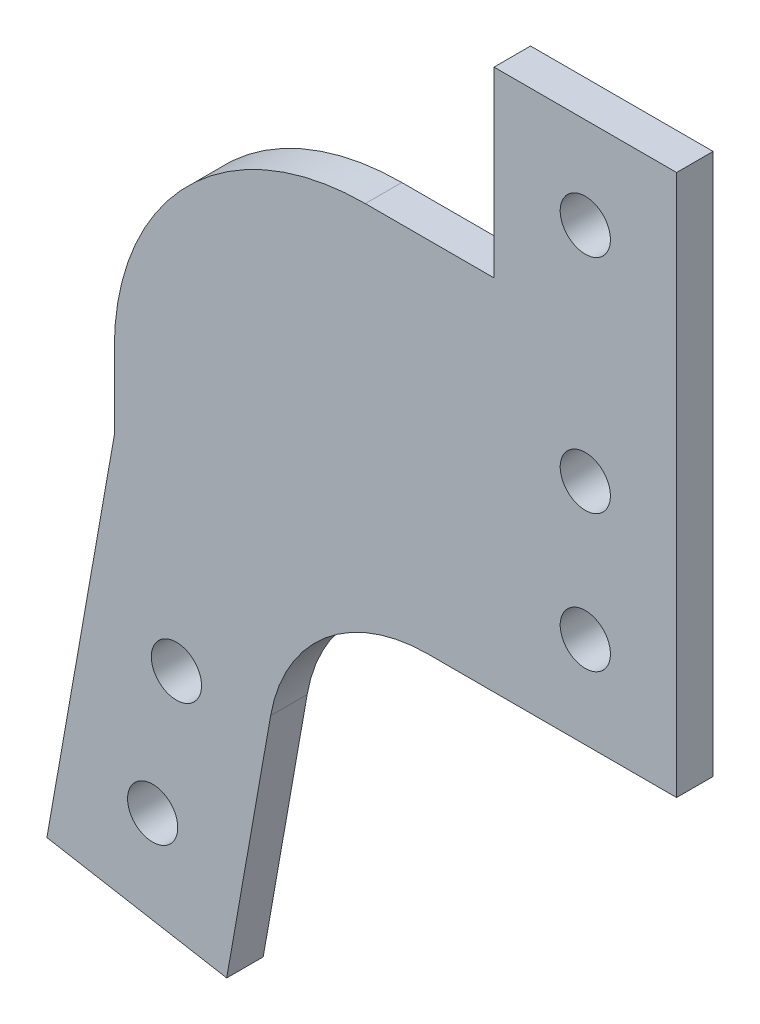
ISO-10303-21;
HEADER;
FILE_DESCRIPTION(('STEP AP214'),'2;1');
FILE_NAME('part.step','',(''),(''),'','','');
FILE_SCHEMA(('AUTOMOTIVE_DESIGN { 1 0 10303 214 1 1 1 1 }'));
ENDSEC;
DATA;
#1=APPLICATION_CONTEXT('core data for automotive mechanical design processes');
#2=APPLICATION_PROTOCOL_DEFINITION('international standard','automotive_design',2000,#1);
#3=PRODUCT_CONTEXT('',#1,'mechanical');
#4=PRODUCT('Part','Part','',(#3));
#5=PRODUCT_RELATED_PRODUCT_CATEGORY('part','',(#4));
#6=PRODUCT_DEFINITION_FORMATION('','',#4);
#7=PRODUCT_DEFINITION_CONTEXT('part definition',#1,'design');
#8=PRODUCT_DEFINITION('design','',#6,#7);
#9=PRODUCT_DEFINITION_SHAPE('','',#8);
#10=(LENGTH_UNIT() NAMED_UNIT(*) SI_UNIT(.MILLI.,.METRE.));
#11=(NAMED_UNIT(*) PLANE_ANGLE_UNIT() SI_UNIT($,.RADIAN.));
#12=(NAMED_UNIT(*) SI_UNIT($,.STERADIAN.) SOLID_ANGLE_UNIT());
#13=UNCERTAINTY_MEASURE_WITH_UNIT(LENGTH_MEASURE(1.E-05),#10,'distance_accuracy_value','');
#14=(GEOMETRIC_REPRESENTATION_CONTEXT(3) GLOBAL_UNCERTAINTY_ASSIGNED_CONTEXT((#13)) GLOBAL_UNIT_ASSIGNED_CONTEXT((#10,
#11,#12)) REPRESENTATION_CONTEXT('',''));
#15=CARTESIAN_POINT('',(0.,0.,0.));
#16=DIRECTION('',(0.,0.,1.));
#17=DIRECTION('',(1.,0.,0.));
#18=AXIS2_PLACEMENT_3D('',#15,#16,#17);
#19=CARTESIAN_POINT('',(7.82058165548103,11.8,4.));
#20=DIRECTION('',(0.,0.,1.));
#21=DIRECTION('',(1.,0.,0.));
#22=AXIS2_PLACEMENT_3D('',#19,#20,#21);
#23=PLANE('',#22);
#24=CARTESIAN_POINT('',(-15.474906588572,-30.174851564615,4.));
#25=DIRECTION('',(0.,0.,1.));
#26=DIRECTION('',(1.,0.,0.));
#27=AXIS2_PLACEMENT_3D('',#24,#25,#26);
#28=CIRCLE('',#27,2.75);
#29=CARTESIAN_POINT('',(-12.724906588572,-30.174851564615,4.));
#30=VERTEX_POINT('',#29);
#31=EDGE_CURVE('E281',#30,#30,#28,.T.);
#32=ORIENTED_EDGE('',*,*,#31,.F.);
#33=EDGE_LOOP('',(#32));
#34=FACE_BOUND('',#33,.T.);
#35=CARTESIAN_POINT('',(31.920581655481,25.,4.));
#36=DIRECTION('',(0.,0.,1.));
#37=DIRECTION('',(1.,0.,0.));
#38=AXIS2_PLACEMENT_3D('',#35,#36,#37);
#39=CIRCLE('',#38,2.75);
#40=CARTESIAN_POINT('',(34.670581655481,25.,4.));
#41=VERTEX_POINT('',#40);
#42=EDGE_CURVE('E293',#41,#41,#39,.T.);
#43=ORIENTED_EDGE('',*,*,#42,.F.);
#44=EDGE_LOOP('',(#43));
#45=FACE_BOUND('',#44,.T.);
#46=DIRECTION('',(0.,1.,0.));
#47=VECTOR('',#46,1.);
#48=CARTESIAN_POINT('',(41.920581655481,0.,4.));
#49=LINE('',#48,#47);
#50=CARTESIAN_POINT('',(41.920581655481,0.,4.));
#51=VERTEX_POINT('',#50);
#52=CARTESIAN_POINT('',(41.920581655481,59.3,4.));
#53=VERTEX_POINT('',#52);
#54=EDGE_CURVE('E169',#51,#53,#49,.T.);
#55=ORIENTED_EDGE('',*,*,#54,.T.);
#56=DIRECTION('',(-1.,0.,0.));
#57=VECTOR('',#56,1.);
#58=CARTESIAN_POINT('',(41.920581655481,59.3,4.));
#59=LINE('',#58,#57);
#60=CARTESIAN_POINT('',(21.920581655481,59.3,4.));
#61=VERTEX_POINT('',#60);
#62=EDGE_CURVE('E102',#53,#61,#59,.T.);
#63=ORIENTED_EDGE('',*,*,#62,.T.);
#64=DIRECTION('',(0.,-1.,0.));
#65=VECTOR('',#64,1.);
#66=CARTESIAN_POINT('',(21.920581655481,59.3,4.));
#67=LINE('',#66,#65);
#68=CARTESIAN_POINT('',(21.920581655481,39.3,4.));
#69=VERTEX_POINT('',#68);
#70=EDGE_CURVE('E193',#61,#69,#67,.T.);
#71=ORIENTED_EDGE('',*,*,#70,.T.);
#72=DIRECTION('',(-1.,0.,0.));
#73=VECTOR('',#72,1.);
#74=CARTESIAN_POINT('',(21.920581655481,39.3,4.));
#75=LINE('',#74,#73);
#76=CARTESIAN_POINT('',(7.82058165548122,39.3,4.));
#77=VERTEX_POINT('',#76);
#78=EDGE_CURVE('E212',#69,#77,#75,.T.);
#79=ORIENTED_EDGE('',*,*,#78,.T.);
#80=CARTESIAN_POINT('',(7.82058165548103,11.8,4.));
#81=DIRECTION('',(0.,0.,1.));
#82=DIRECTION('',(1.,0.,0.));
#83=AXIS2_PLACEMENT_3D('',#80,#81,#82);
#84=CIRCLE('',#83,27.5);
#85=CARTESIAN_POINT('',(-19.679418344519,11.7999999999998,4.));
#86=VERTEX_POINT('',#85);
#87=EDGE_CURVE('E209',#77,#86,#84,.T.);
#88=ORIENTED_EDGE('',*,*,#87,.T.);
#89=DIRECTION('',(0.,-1.,0.));
#90=VECTOR('',#89,1.);
#91=CARTESIAN_POINT('',(-19.679418344519,3.56788218495101,4.));
#92=LINE('',#91,#90);
#93=CARTESIAN_POINT('',(-19.679418344519,3.56788218495101,4.));
#94=VERTEX_POINT('',#93);
#95=EDGE_CURVE('E211',#86,#94,#92,.T.);
#96=ORIENTED_EDGE('',*,*,#95,.T.);
#97=DIRECTION('',(-0.173648177666927,-0.984807753012209,0.));
#98=VECTOR('',#97,1.);
#99=CARTESIAN_POINT('',(-27.0594658953634,-38.2864473180679,4.));
#100=LINE('',#99,#98);
#101=CARTESIAN_POINT('',(-27.0594658953634,-38.2864473180679,4.));
#102=VERTEX_POINT('',#101);
#103=EDGE_CURVE('E214',#94,#102,#100,.T.);
#104=ORIENTED_EDGE('',*,*,#103,.T.);
#105=DIRECTION('',(0.984807753012209,-0.173648177666928,0.));
#106=VECTOR('',#105,1.);
#107=CARTESIAN_POINT('',(-27.0594658953634,-38.2864473180679,4.));
#108=LINE('',#107,#106);
#109=CARTESIAN_POINT('',(-7.36331083511921,-41.7594108714064,4.));
#110=VERTEX_POINT('',#109);
#111=EDGE_CURVE('E130',#102,#110,#108,.T.);
#112=ORIENTED_EDGE('',*,*,#111,.T.);
#113=DIRECTION('',(0.173648177666927,0.984807753012208,0.));
#114=VECTOR('',#113,1.);
#115=CARTESIAN_POINT('',(-7.36331083511921,-41.7594108714064,4.));
#116=LINE('',#115,#114);
#117=CARTESIAN_POINT('',(-2.54989213211122,-14.4611568908289,4.));
#118=VERTEX_POINT('',#117);
#119=EDGE_CURVE('E124',#110,#118,#116,.T.);
#120=ORIENTED_EDGE('',*,*,#119,.T.);
#121=CARTESIAN_POINT('',(14.6842435456024,-17.5,4.));
#122=DIRECTION('',(0.,0.,-1.));
#123=DIRECTION('',(-1.,0.,0.));
#124=AXIS2_PLACEMENT_3D('',#121,#122,#123);
#125=CIRCLE('',#124,17.5);
#126=CARTESIAN_POINT('',(14.6842435456026,0.,4.));
#127=VERTEX_POINT('',#126);
#128=EDGE_CURVE('E128',#118,#127,#125,.T.);
#129=ORIENTED_EDGE('',*,*,#128,.T.);
#130=DIRECTION('',(1.,0.,0.));
#131=VECTOR('',#130,1.);
#132=CARTESIAN_POINT('',(14.6842435456026,0.,4.));
#133=LINE('',#132,#131);
#134=EDGE_CURVE('E50',#127,#51,#133,.T.);
#135=ORIENTED_EDGE('',*,*,#134,.T.);
#136=EDGE_LOOP('',(#55,#63,#71,#79,#88,#96,#104,#112,#120,#129,#135));
#137=FACE_BOUND('',#136,.T.);
#138=CARTESIAN_POINT('',(31.920581655481,49.3,4.));
#139=DIRECTION('',(0.,0.,1.));
#140=DIRECTION('',(1.,0.,0.));
#141=AXIS2_PLACEMENT_3D('',#138,#139,#140);
#142=CIRCLE('',#141,2.75);
#143=CARTESIAN_POINT('',(34.670581655481,49.3,4.));
#144=VERTEX_POINT('',#143);
#145=EDGE_CURVE('E152',#144,#144,#142,.T.);
#146=ORIENTED_EDGE('',*,*,#145,.F.);
#147=EDGE_LOOP('',(#146));
#148=FACE_BOUND('',#147,.T.);
#149=CARTESIAN_POINT('',(31.920581655481,10.,4.));
#150=DIRECTION('',(0.,0.,1.));
#151=DIRECTION('',(1.,0.,0.));
#152=AXIS2_PLACEMENT_3D('',#149,#150,#151);
#153=CIRCLE('',#152,2.75);
#154=CARTESIAN_POINT('',(34.670581655481,10.,4.));
#155=VERTEX_POINT('',#154);
#156=EDGE_CURVE('E287',#155,#155,#153,.T.);
#157=ORIENTED_EDGE('',*,*,#156,.F.);
#158=EDGE_LOOP('',(#157));
#159=FACE_BOUND('',#158,.T.);
#160=CARTESIAN_POINT('',(-12.8701839235681,-15.4027352694319,4.));
#161=DIRECTION('',(0.,0.,1.));
#162=DIRECTION('',(1.,0.,0.));
#163=AXIS2_PLACEMENT_3D('',#160,#161,#162);
#164=CIRCLE('',#163,2.75);
#165=CARTESIAN_POINT('',(-10.1201839235681,-15.4027352694319,4.));
#166=VERTEX_POINT('',#165);
#167=EDGE_CURVE('E272',#166,#166,#164,.T.);
#168=ORIENTED_EDGE('',*,*,#167,.F.);
#169=EDGE_LOOP('',(#168));
#170=FACE_BOUND('',#169,.T.);
#171=ADVANCED_FACE('F33',(#34,#45,#137,#148,#159,#170),#23,.T.);
#172=CARTESIAN_POINT('',(7.82058165548103,11.8,0.));
#173=DIRECTION('',(0.,0.,1.));
#174=DIRECTION('',(1.,0.,0.));
#175=AXIS2_PLACEMENT_3D('',#172,#173,#174);
#176=PLANE('',#175);
#177=DIRECTION('',(0.,1.,0.));
#178=VECTOR('',#177,1.);
#179=CARTESIAN_POINT('',(41.920581655481,0.,0.));
#180=LINE('',#179,#178);
#181=CARTESIAN_POINT('',(41.920581655481,0.,0.));
#182=VERTEX_POINT('',#181);
#183=CARTESIAN_POINT('',(41.920581655481,59.3,0.));
#184=VERTEX_POINT('',#183);
#185=EDGE_CURVE('E148',#182,#184,#180,.T.);
#186=ORIENTED_EDGE('',*,*,#185,.F.);
#187=DIRECTION('',(1.,0.,0.));
#188=VECTOR('',#187,1.);
#189=CARTESIAN_POINT('',(14.6842435456026,0.,0.));
#190=LINE('',#189,#188);
#191=CARTESIAN_POINT('',(14.6842435456026,0.,0.));
#192=VERTEX_POINT('',#191);
#193=EDGE_CURVE('E94',#192,#182,#190,.T.);
#194=ORIENTED_EDGE('',*,*,#193,.F.);
#195=CARTESIAN_POINT('',(14.6842435456024,-17.5,0.));
#196=DIRECTION('',(0.,0.,-1.));
#197=DIRECTION('',(-1.,0.,0.));
#198=AXIS2_PLACEMENT_3D('',#195,#196,#197);
#199=CIRCLE('',#198,17.5);
#200=CARTESIAN_POINT('',(-2.54989213211122,-14.4611568908289,0.));
#201=VERTEX_POINT('',#200);
#202=EDGE_CURVE('E88',#201,#192,#199,.T.);
#203=ORIENTED_EDGE('',*,*,#202,.F.);
#204=DIRECTION('',(0.173648177666927,0.984807753012208,0.));
#205=VECTOR('',#204,1.);
#206=CARTESIAN_POINT('',(-7.36331083511921,-41.7594108714064,0.));
#207=LINE('',#206,#205);
#208=CARTESIAN_POINT('',(-7.36331083511921,-41.7594108714064,0.));
#209=VERTEX_POINT('',#208);
#210=EDGE_CURVE('E138',#209,#201,#207,.T.);
#211=ORIENTED_EDGE('',*,*,#210,.F.);
#212=DIRECTION('',(0.984807753012209,-0.173648177666928,0.));
#213=VECTOR('',#212,1.);
#214=CARTESIAN_POINT('',(-27.0594658953634,-38.2864473180679,0.));
#215=LINE('',#214,#213);
#216=CARTESIAN_POINT('',(-27.0594658953634,-38.2864473180679,0.));
#217=VERTEX_POINT('',#216);
#218=EDGE_CURVE('E164',#217,#209,#215,.T.);
#219=ORIENTED_EDGE('',*,*,#218,.F.);
#220=DIRECTION('',(-0.173648177666927,-0.984807753012209,0.));
#221=VECTOR('',#220,1.);
#222=CARTESIAN_POINT('',(-27.0594658953634,-38.2864473180679,0.));
#223=LINE('',#222,#221);
#224=CARTESIAN_POINT('',(-19.679418344519,3.56788218495101,0.));
#225=VERTEX_POINT('',#224);
#226=EDGE_CURVE('E162',#225,#217,#223,.T.);
#227=ORIENTED_EDGE('',*,*,#226,.F.);
#228=DIRECTION('',(0.,-1.,0.));
#229=VECTOR('',#228,1.);
#230=CARTESIAN_POINT('',(-19.679418344519,3.56788218495101,0.));
#231=LINE('',#230,#229);
#232=CARTESIAN_POINT('',(-19.679418344519,11.7999999999998,0.));
#233=VERTEX_POINT('',#232);
#234=EDGE_CURVE('E160',#233,#225,#231,.T.);
#235=ORIENTED_EDGE('',*,*,#234,.F.);
#236=CARTESIAN_POINT('',(7.82058165548103,11.8,0.));
#237=DIRECTION('',(0.,0.,1.));
#238=DIRECTION('',(1.,0.,0.));
#239=AXIS2_PLACEMENT_3D('',#236,#237,#238);
#240=CIRCLE('',#239,27.5);
#241=CARTESIAN_POINT('',(7.82058165548122,39.3,0.));
#242=VERTEX_POINT('',#241);
#243=EDGE_CURVE('E158',#242,#233,#240,.T.);
#244=ORIENTED_EDGE('',*,*,#243,.F.);
#245=DIRECTION('',(-1.,0.,0.));
#246=VECTOR('',#245,1.);
#247=CARTESIAN_POINT('',(21.920581655481,39.3,0.));
#248=LINE('',#247,#246);
#249=CARTESIAN_POINT('',(21.920581655481,39.3,0.));
#250=VERTEX_POINT('',#249);
#251=EDGE_CURVE('E156',#250,#242,#248,.T.);
#252=ORIENTED_EDGE('',*,*,#251,.F.);
#253=DIRECTION('',(0.,-1.,0.));
#254=VECTOR('',#253,1.);
#255=CARTESIAN_POINT('',(21.920581655481,59.3,0.));
#256=LINE('',#255,#254);
#257=CARTESIAN_POINT('',(21.920581655481,59.3,0.));
#258=VERTEX_POINT('',#257);
#259=EDGE_CURVE('E154',#258,#250,#256,.T.);
#260=ORIENTED_EDGE('',*,*,#259,.F.);
#261=DIRECTION('',(-1.,0.,0.));
#262=VECTOR('',#261,1.);
#263=CARTESIAN_POINT('',(41.920581655481,59.3,0.));
#264=LINE('',#263,#262);
#265=EDGE_CURVE('E151',#184,#258,#264,.T.);
#266=ORIENTED_EDGE('',*,*,#265,.F.);
#267=EDGE_LOOP('',(#186,#194,#203,#211,#219,#227,#235,#244,#252,#260,#266));
#268=FACE_BOUND('',#267,.T.);
#269=CARTESIAN_POINT('',(31.920581655481,49.3,0.));
#270=DIRECTION('',(0.,0.,1.));
#271=DIRECTION('',(1.,0.,0.));
#272=AXIS2_PLACEMENT_3D('',#269,#270,#271);
#273=CIRCLE('',#272,2.75);
#274=CARTESIAN_POINT('',(34.670581655481,49.3,0.));
#275=VERTEX_POINT('',#274);
#276=EDGE_CURVE('E296',#275,#275,#273,.T.);
#277=ORIENTED_EDGE('',*,*,#276,.T.);
#278=EDGE_LOOP('',(#277));
#279=FACE_BOUND('',#278,.T.);
#280=CARTESIAN_POINT('',(31.920581655481,25.,0.));
#281=DIRECTION('',(0.,0.,1.));
#282=DIRECTION('',(1.,0.,0.));
#283=AXIS2_PLACEMENT_3D('',#280,#281,#282);
#284=CIRCLE('',#283,2.75);
#285=CARTESIAN_POINT('',(34.670581655481,25.,0.));
#286=VERTEX_POINT('',#285);
#287=EDGE_CURVE('E290',#286,#286,#284,.T.);
#288=ORIENTED_EDGE('',*,*,#287,.T.);
#289=EDGE_LOOP('',(#288));
#290=FACE_BOUND('',#289,.T.);
#291=CARTESIAN_POINT('',(31.920581655481,10.,0.));
#292=DIRECTION('',(0.,0.,1.));
#293=DIRECTION('',(1.,0.,0.));
#294=AXIS2_PLACEMENT_3D('',#291,#292,#293);
#295=CIRCLE('',#294,2.75);
#296=CARTESIAN_POINT('',(34.670581655481,10.,0.));
#297=VERTEX_POINT('',#296);
#298=EDGE_CURVE('E284',#297,#297,#295,.T.);
#299=ORIENTED_EDGE('',*,*,#298,.T.);
#300=EDGE_LOOP('',(#299));
#301=FACE_BOUND('',#300,.T.);
#302=CARTESIAN_POINT('',(-15.474906588572,-30.174851564615,0.));
#303=DIRECTION('',(0.,0.,1.));
#304=DIRECTION('',(1.,0.,0.));
#305=AXIS2_PLACEMENT_3D('',#302,#303,#304);
#306=CIRCLE('',#305,2.75);
#307=CARTESIAN_POINT('',(-12.724906588572,-30.174851564615,0.));
#308=VERTEX_POINT('',#307);
#309=EDGE_CURVE('E278',#308,#308,#306,.T.);
#310=ORIENTED_EDGE('',*,*,#309,.T.);
#311=EDGE_LOOP('',(#310));
#312=FACE_BOUND('',#311,.T.);
#313=CARTESIAN_POINT('',(-12.8701839235681,-15.4027352694319,0.));
#314=DIRECTION('',(0.,0.,1.));
#315=DIRECTION('',(1.,0.,0.));
#316=AXIS2_PLACEMENT_3D('',#313,#314,#315);
#317=CIRCLE('',#316,2.75);
#318=CARTESIAN_POINT('',(-10.1201839235681,-15.4027352694319,0.));
#319=VERTEX_POINT('',#318);
#320=EDGE_CURVE('E275',#319,#319,#317,.T.);
#321=ORIENTED_EDGE('',*,*,#320,.T.);
#322=EDGE_LOOP('',(#321));
#323=FACE_BOUND('',#322,.T.);
#324=ADVANCED_FACE('F197',(#268,#279,#290,#301,#312,#323),#176,.F.);
#325=CARTESIAN_POINT('',(41.920581655481,0.,4.));
#326=DIRECTION('',(-1.,0.,0.));
#327=DIRECTION('',(0.,0.,1.));
#328=AXIS2_PLACEMENT_3D('',#325,#326,#327);
#329=PLANE('',#328);
#330=ORIENTED_EDGE('',*,*,#185,.T.);
#331=DIRECTION('',(0.,0.,-1.));
#332=VECTOR('',#331,1.);
#333=CARTESIAN_POINT('',(41.920581655481,59.3,4.));
#334=LINE('',#333,#332);
#335=EDGE_CURVE('E11',#53,#184,#334,.T.);
#336=ORIENTED_EDGE('',*,*,#335,.F.);
#337=ORIENTED_EDGE('',*,*,#54,.F.);
#338=DIRECTION('',(0.,0.,-1.));
#339=VECTOR('',#338,1.);
#340=CARTESIAN_POINT('',(41.920581655481,0.,4.));
#341=LINE('',#340,#339);
#342=EDGE_CURVE('E144',#51,#182,#341,.T.);
#343=ORIENTED_EDGE('',*,*,#342,.T.);
#344=EDGE_LOOP('',(#330,#336,#337,#343));
#345=FACE_BOUND('',#344,.T.);
#346=ADVANCED_FACE('F35',(#345),#329,.F.);
#347=CARTESIAN_POINT('',(41.920581655481,59.3,4.));
#348=DIRECTION('',(0.,-1.,0.));
#349=DIRECTION('',(0.,0.,-1.));
#350=AXIS2_PLACEMENT_3D('',#347,#348,#349);
#351=PLANE('',#350);
#352=ORIENTED_EDGE('',*,*,#265,.T.);
#353=DIRECTION('',(0.,0.,-1.));
#354=VECTOR('',#353,1.);
#355=CARTESIAN_POINT('',(21.920581655481,59.3,4.));
#356=LINE('',#355,#354);
#357=EDGE_CURVE('E42',#61,#258,#356,.T.);
#358=ORIENTED_EDGE('',*,*,#357,.F.);
#359=ORIENTED_EDGE('',*,*,#62,.F.);
#360=ORIENTED_EDGE('',*,*,#335,.T.);
#361=EDGE_LOOP('',(#352,#358,#359,#360));
#362=FACE_BOUND('',#361,.T.);
#363=ADVANCED_FACE('F405',(#362),#351,.F.);
#364=CARTESIAN_POINT('',(21.920581655481,59.3,4.));
#365=DIRECTION('',(1.,0.,0.));
#366=DIRECTION('',(0.,0.,-1.));
#367=AXIS2_PLACEMENT_3D('',#364,#365,#366);
#368=PLANE('',#367);
#369=ORIENTED_EDGE('',*,*,#259,.T.);
#370=DIRECTION('',(0.,0.,-1.));
#371=VECTOR('',#370,1.);
#372=CARTESIAN_POINT('',(21.920581655481,39.3,4.));
#373=LINE('',#372,#371);
#374=EDGE_CURVE('E185',#69,#250,#373,.T.);
#375=ORIENTED_EDGE('',*,*,#374,.F.);
#376=ORIENTED_EDGE('',*,*,#70,.F.);
#377=ORIENTED_EDGE('',*,*,#357,.T.);
#378=EDGE_LOOP('',(#369,#375,#376,#377));
#379=FACE_BOUND('',#378,.T.);
#380=ADVANCED_FACE('F191',(#379),#368,.F.);
#381=CARTESIAN_POINT('',(21.920581655481,39.3,4.));
#382=DIRECTION('',(0.,-1.,0.));
#383=DIRECTION('',(0.,0.,-1.));
#384=AXIS2_PLACEMENT_3D('',#381,#382,#383);
#385=PLANE('',#384);
#386=ORIENTED_EDGE('',*,*,#251,.T.);
#387=DIRECTION('',(0.,0.,-1.));
#388=VECTOR('',#387,1.);
#389=CARTESIAN_POINT('',(7.82058165548122,39.3,4.));
#390=LINE('',#389,#388);
#391=EDGE_CURVE('E182',#77,#242,#390,.T.);
#392=ORIENTED_EDGE('',*,*,#391,.F.);
#393=ORIENTED_EDGE('',*,*,#78,.F.);
#394=ORIENTED_EDGE('',*,*,#374,.T.);
#395=EDGE_LOOP('',(#386,#392,#393,#394));
#396=FACE_BOUND('',#395,.T.);
#397=ADVANCED_FACE('F203',(#396),#385,.F.);
#398=CARTESIAN_POINT('',(7.82058165548103,11.8,4.));
#399=DIRECTION('',(0.,0.,-1.));
#400=DIRECTION('',(-1.,0.,0.));
#401=AXIS2_PLACEMENT_3D('',#398,#399,#400);
#402=CYLINDRICAL_SURFACE('',#401,27.5);
#403=ORIENTED_EDGE('',*,*,#243,.T.);
#404=DIRECTION('',(0.,0.,-1.));
#405=VECTOR('',#404,1.);
#406=CARTESIAN_POINT('',(-19.679418344519,11.7999999999998,4.));
#407=LINE('',#406,#405);
#408=EDGE_CURVE('E179',#86,#233,#407,.T.);
#409=ORIENTED_EDGE('',*,*,#408,.F.);
#410=ORIENTED_EDGE('',*,*,#87,.F.);
#411=ORIENTED_EDGE('',*,*,#391,.T.);
#412=EDGE_LOOP('',(#403,#409,#410,#411));
#413=FACE_BOUND('',#412,.T.);
#414=ADVANCED_FACE('F207',(#413),#402,.T.);
#415=CARTESIAN_POINT('',(-19.679418344519,3.56788218495101,4.));
#416=DIRECTION('',(1.,0.,0.));
#417=DIRECTION('',(0.,0.,-1.));
#418=AXIS2_PLACEMENT_3D('',#415,#416,#417);
#419=PLANE('',#418);
#420=ORIENTED_EDGE('',*,*,#234,.T.);
#421=DIRECTION('',(0.,0.,-1.));
#422=VECTOR('',#421,1.);
#423=CARTESIAN_POINT('',(-19.679418344519,3.56788218495101,4.));
#424=LINE('',#423,#422);
#425=EDGE_CURVE('E176',#94,#225,#424,.T.);
#426=ORIENTED_EDGE('',*,*,#425,.F.);
#427=ORIENTED_EDGE('',*,*,#95,.F.);
#428=ORIENTED_EDGE('',*,*,#408,.T.);
#429=EDGE_LOOP('',(#420,#426,#427,#428));
#430=FACE_BOUND('',#429,.T.);
#431=ADVANCED_FACE('F371',(#430),#419,.F.);
#432=CARTESIAN_POINT('',(-27.0594658953634,-38.2864473180679,4.));
#433=DIRECTION('',(0.984807753012209,-0.173648177666927,0.));
#434=DIRECTION('',(0.173648177666927,0.984807753012209,0.));
#435=AXIS2_PLACEMENT_3D('',#432,#433,#434);
#436=PLANE('',#435);
#437=ORIENTED_EDGE('',*,*,#226,.T.);
#438=DIRECTION('',(0.,0.,-1.));
#439=VECTOR('',#438,1.);
#440=CARTESIAN_POINT('',(-27.0594658953634,-38.2864473180679,4.));
#441=LINE('',#440,#439);
#442=EDGE_CURVE('E173',#102,#217,#441,.T.);
#443=ORIENTED_EDGE('',*,*,#442,.F.);
#444=ORIENTED_EDGE('',*,*,#103,.F.);
#445=ORIENTED_EDGE('',*,*,#425,.T.);
#446=EDGE_LOOP('',(#437,#443,#444,#445));
#447=FACE_BOUND('',#446,.T.);
#448=ADVANCED_FACE('F223',(#447),#436,.F.);
#449=CARTESIAN_POINT('',(-27.0594658953634,-38.2864473180679,4.));
#450=DIRECTION('',(0.173648177666928,0.984807753012209,0.));
#451=DIRECTION('',(-0.984807753012209,0.173648177666928,0.));
#452=AXIS2_PLACEMENT_3D('',#449,#450,#451);
#453=PLANE('',#452);
#454=ORIENTED_EDGE('',*,*,#218,.T.);
#455=DIRECTION('',(0.,0.,-1.));
#456=VECTOR('',#455,1.);
#457=CARTESIAN_POINT('',(-7.36331083511921,-41.7594108714064,4.));
#458=LINE('',#457,#456);
#459=EDGE_CURVE('E139',#110,#209,#458,.T.);
#460=ORIENTED_EDGE('',*,*,#459,.F.);
#461=ORIENTED_EDGE('',*,*,#111,.F.);
#462=ORIENTED_EDGE('',*,*,#442,.T.);
#463=EDGE_LOOP('',(#454,#460,#461,#462));
#464=FACE_BOUND('',#463,.T.);
#465=ADVANCED_FACE('F227',(#464),#453,.F.);
#466=CARTESIAN_POINT('',(-7.36331083511921,-41.7594108714064,4.));
#467=DIRECTION('',(-0.984807753012209,0.173648177666927,0.));
#468=DIRECTION('',(-0.173648177666927,-0.984807753012209,0.));
#469=AXIS2_PLACEMENT_3D('',#466,#467,#468);
#470=PLANE('',#469);
#471=ORIENTED_EDGE('',*,*,#210,.T.);
#472=DIRECTION('',(0.,0.,-1.));
#473=VECTOR('',#472,1.);
#474=CARTESIAN_POINT('',(-2.54989213211122,-14.4611568908289,4.));
#475=LINE('',#474,#473);
#476=EDGE_CURVE('E135',#118,#201,#475,.T.);
#477=ORIENTED_EDGE('',*,*,#476,.F.);
#478=ORIENTED_EDGE('',*,*,#119,.F.);
#479=ORIENTED_EDGE('',*,*,#459,.T.);
#480=EDGE_LOOP('',(#471,#477,#478,#479));
#481=FACE_BOUND('',#480,.T.);
#482=ADVANCED_FACE('F136',(#481),#470,.F.);
#483=CARTESIAN_POINT('',(14.6842435456024,-17.5,4.));
#484=DIRECTION('',(0.,0.,-1.));
#485=DIRECTION('',(-1.,0.,0.));
#486=AXIS2_PLACEMENT_3D('',#483,#484,#485);
#487=CYLINDRICAL_SURFACE('',#486,17.5);
#488=ORIENTED_EDGE('',*,*,#202,.T.);
#489=DIRECTION('',(0.,0.,-1.));
#490=VECTOR('',#489,1.);
#491=CARTESIAN_POINT('',(14.6842435456026,0.,4.));
#492=LINE('',#491,#490);
#493=EDGE_CURVE('E140',#127,#192,#492,.T.);
#494=ORIENTED_EDGE('',*,*,#493,.F.);
#495=ORIENTED_EDGE('',*,*,#128,.F.);
#496=ORIENTED_EDGE('',*,*,#476,.T.);
#497=EDGE_LOOP('',(#488,#494,#495,#496));
#498=FACE_BOUND('',#497,.T.);
#499=ADVANCED_FACE('F142',(#498),#487,.F.);
#500=CARTESIAN_POINT('',(14.6842435456026,0.,4.));
#501=DIRECTION('',(0.,1.,0.));
#502=DIRECTION('',(0.,0.,1.));
#503=AXIS2_PLACEMENT_3D('',#500,#501,#502);
#504=PLANE('',#503);
#505=ORIENTED_EDGE('',*,*,#193,.T.);
#506=ORIENTED_EDGE('',*,*,#342,.F.);
#507=ORIENTED_EDGE('',*,*,#134,.F.);
#508=ORIENTED_EDGE('',*,*,#493,.T.);
#509=EDGE_LOOP('',(#505,#506,#507,#508));
#510=FACE_BOUND('',#509,.T.);
#511=ADVANCED_FACE('F231',(#510),#504,.F.);
#512=CARTESIAN_POINT('',(31.920581655481,49.3,4.));
#513=DIRECTION('',(0.,0.,-1.));
#514=DIRECTION('',(-1.,0.,0.));
#515=AXIS2_PLACEMENT_3D('',#512,#513,#514);
#516=CYLINDRICAL_SURFACE('',#515,2.75);
#517=ORIENTED_EDGE('',*,*,#145,.T.);
#518=EDGE_LOOP('',(#517));
#519=FACE_BOUND('',#518,.T.);
#520=ORIENTED_EDGE('',*,*,#276,.F.);
#521=EDGE_LOOP('',(#520));
#522=FACE_BOUND('',#521,.T.);
#523=ADVANCED_FACE('F233',(#519,#522),#516,.F.);
#524=CARTESIAN_POINT('',(31.920581655481,25.,4.));
#525=DIRECTION('',(0.,0.,-1.));
#526=DIRECTION('',(-1.,0.,0.));
#527=AXIS2_PLACEMENT_3D('',#524,#525,#526);
#528=CYLINDRICAL_SURFACE('',#527,2.75);
#529=ORIENTED_EDGE('',*,*,#42,.T.);
#530=EDGE_LOOP('',(#529));
#531=FACE_BOUND('',#530,.T.);
#532=ORIENTED_EDGE('',*,*,#287,.F.);
#533=EDGE_LOOP('',(#532));
#534=FACE_BOUND('',#533,.T.);
#535=ADVANCED_FACE('F239',(#531,#534),#528,.F.);
#536=CARTESIAN_POINT('',(31.920581655481,10.,4.));
#537=DIRECTION('',(0.,0.,-1.));
#538=DIRECTION('',(-1.,0.,0.));
#539=AXIS2_PLACEMENT_3D('',#536,#537,#538);
#540=CYLINDRICAL_SURFACE('',#539,2.75);
#541=ORIENTED_EDGE('',*,*,#156,.T.);
#542=EDGE_LOOP('',(#541));
#543=FACE_BOUND('',#542,.T.);
#544=ORIENTED_EDGE('',*,*,#298,.F.);
#545=EDGE_LOOP('',(#544));
#546=FACE_BOUND('',#545,.T.);
#547=ADVANCED_FACE('F255',(#543,#546),#540,.F.);
#548=CARTESIAN_POINT('',(-15.474906588572,-30.174851564615,4.));
#549=DIRECTION('',(0.,0.,-1.));
#550=DIRECTION('',(-1.,0.,0.));
#551=AXIS2_PLACEMENT_3D('',#548,#549,#550);
#552=CYLINDRICAL_SURFACE('',#551,2.75);
#553=ORIENTED_EDGE('',*,*,#31,.T.);
#554=EDGE_LOOP('',(#553));
#555=FACE_BOUND('',#554,.T.);
#556=ORIENTED_EDGE('',*,*,#309,.F.);
#557=EDGE_LOOP('',(#556));
#558=FACE_BOUND('',#557,.T.);
#559=ADVANCED_FACE('F259',(#555,#558),#552,.F.);
#560=CARTESIAN_POINT('',(-12.8701839235681,-15.4027352694319,4.));
#561=DIRECTION('',(0.,0.,-1.));
#562=DIRECTION('',(-1.,0.,0.));
#563=AXIS2_PLACEMENT_3D('',#560,#561,#562);
#564=CYLINDRICAL_SURFACE('',#563,2.75);
#565=ORIENTED_EDGE('',*,*,#167,.T.);
#566=EDGE_LOOP('',(#565));
#567=FACE_BOUND('',#566,.T.);
#568=ORIENTED_EDGE('',*,*,#320,.F.);
#569=EDGE_LOOP('',(#568));
#570=FACE_BOUND('',#569,.T.);
#571=ADVANCED_FACE('F263',(#567,#570),#564,.F.);
#572=CLOSED_SHELL('',(#171,#324,#346,#363,#380,#397,#414,#431,#448,#465,#482,#499,#511,#523,
#535,#547,#559,#571));
#573=MANIFOLD_SOLID_BREP('B2',#572);
#574=ADVANCED_BREP_SHAPE_REPRESENTATION('',(#18,#573),#14);
#575=SHAPE_DEFINITION_REPRESENTATION(#9,#574);
ENDSEC;
END-ISO-10303-21;
